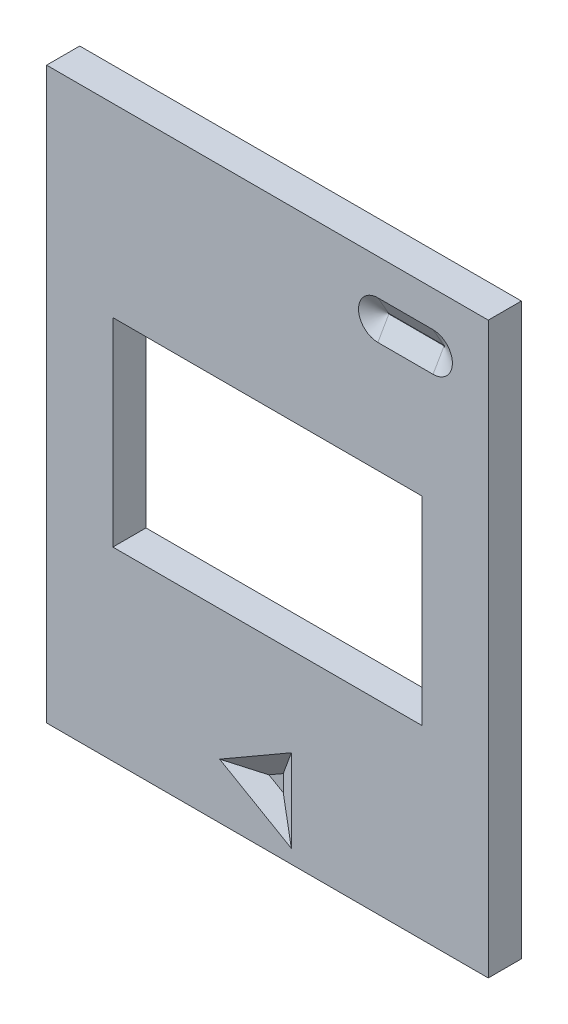
ISO-10303-21;
HEADER;
FILE_DESCRIPTION(('STEP AP214'),'2;1');
FILE_NAME('part.step','',(''),(''),'','','');
FILE_SCHEMA(('AUTOMOTIVE_DESIGN { 1 0 10303 214 1 1 1 1 }'));
ENDSEC;
DATA;
#1=APPLICATION_CONTEXT('core data for automotive mechanical design processes');
#2=APPLICATION_PROTOCOL_DEFINITION('international standard','automotive_design',2000,#1);
#3=PRODUCT_CONTEXT('',#1,'mechanical');
#4=PRODUCT('Part','Part','',(#3));
#5=PRODUCT_RELATED_PRODUCT_CATEGORY('part','',(#4));
#6=PRODUCT_DEFINITION_FORMATION('','',#4);
#7=PRODUCT_DEFINITION_CONTEXT('part definition',#1,'design');
#8=PRODUCT_DEFINITION('design','',#6,#7);
#9=PRODUCT_DEFINITION_SHAPE('','',#8);
#10=(LENGTH_UNIT() NAMED_UNIT(*) SI_UNIT(.MILLI.,.METRE.));
#11=(NAMED_UNIT(*) PLANE_ANGLE_UNIT() SI_UNIT($,.RADIAN.));
#12=(NAMED_UNIT(*) SI_UNIT($,.STERADIAN.) SOLID_ANGLE_UNIT());
#13=UNCERTAINTY_MEASURE_WITH_UNIT(LENGTH_MEASURE(1.E-05),#10,'distance_accuracy_value','');
#14=(GEOMETRIC_REPRESENTATION_CONTEXT(3) GLOBAL_UNCERTAINTY_ASSIGNED_CONTEXT((#13)) GLOBAL_UNIT_ASSIGNED_CONTEXT((#10,
#11,#12)) REPRESENTATION_CONTEXT('',''));
#15=CARTESIAN_POINT('',(0.,0.,0.));
#16=DIRECTION('',(0.,0.,1.));
#17=DIRECTION('',(1.,0.,0.));
#18=AXIS2_PLACEMENT_3D('',#15,#16,#17);
#19=CARTESIAN_POINT('',(40.,0.,-3.));
#20=DIRECTION('',(1.,0.,0.));
#21=DIRECTION('',(0.,0.,-1.));
#22=AXIS2_PLACEMENT_3D('',#19,#20,#21);
#23=PLANE('',#22);
#24=DIRECTION('',(0.,1.,0.));
#25=VECTOR('',#24,1.);
#26=CARTESIAN_POINT('',(40.,0.,0.));
#27=LINE('',#26,#25);
#28=CARTESIAN_POINT('',(40.,0.,0.));
#29=VERTEX_POINT('',#28);
#30=CARTESIAN_POINT('',(40.,51.6,0.));
#31=VERTEX_POINT('',#30);
#32=EDGE_CURVE('E227',#29,#31,#27,.T.);
#33=ORIENTED_EDGE('',*,*,#32,.F.);
#34=DIRECTION('',(0.,0.,1.));
#35=VECTOR('',#34,1.);
#36=CARTESIAN_POINT('',(40.,0.,-3.));
#37=LINE('',#36,#35);
#38=CARTESIAN_POINT('',(40.,0.,-3.));
#39=VERTEX_POINT('',#38);
#40=EDGE_CURVE('E11',#39,#29,#37,.T.);
#41=ORIENTED_EDGE('',*,*,#40,.F.);
#42=DIRECTION('',(0.,1.,0.));
#43=VECTOR('',#42,1.);
#44=CARTESIAN_POINT('',(40.,0.,-3.));
#45=LINE('',#44,#43);
#46=CARTESIAN_POINT('',(40.,51.6,-3.));
#47=VERTEX_POINT('',#46);
#48=EDGE_CURVE('E234',#39,#47,#45,.T.);
#49=ORIENTED_EDGE('',*,*,#48,.T.);
#50=DIRECTION('',(0.,0.,1.));
#51=VECTOR('',#50,1.);
#52=CARTESIAN_POINT('',(40.,51.6,-3.));
#53=LINE('',#52,#51);
#54=EDGE_CURVE('E36',#47,#31,#53,.T.);
#55=ORIENTED_EDGE('',*,*,#54,.T.);
#56=EDGE_LOOP('',(#33,#41,#49,#55));
#57=FACE_BOUND('',#56,.T.);
#58=ADVANCED_FACE('F33',(#57),#23,.T.);
#59=CARTESIAN_POINT('',(0.,0.,-3.));
#60=DIRECTION('',(0.,-1.,0.));
#61=DIRECTION('',(1.,0.,0.));
#62=AXIS2_PLACEMENT_3D('',#59,#60,#61);
#63=PLANE('',#62);
#64=DIRECTION('',(1.,0.,0.));
#65=VECTOR('',#64,1.);
#66=CARTESIAN_POINT('',(0.,0.,0.));
#67=LINE('',#66,#65);
#68=CARTESIAN_POINT('',(0.,0.,0.));
#69=VERTEX_POINT('',#68);
#70=EDGE_CURVE('E238',#69,#29,#67,.T.);
#71=ORIENTED_EDGE('',*,*,#70,.F.);
#72=DIRECTION('',(0.,0.,1.));
#73=VECTOR('',#72,1.);
#74=CARTESIAN_POINT('',(0.,0.,-3.));
#75=LINE('',#74,#73);
#76=CARTESIAN_POINT('',(0.,0.,-3.));
#77=VERTEX_POINT('',#76);
#78=EDGE_CURVE('E41',#77,#69,#75,.T.);
#79=ORIENTED_EDGE('',*,*,#78,.F.);
#80=DIRECTION('',(1.,0.,0.));
#81=VECTOR('',#80,1.);
#82=CARTESIAN_POINT('',(0.,0.,-3.));
#83=LINE('',#82,#81);
#84=EDGE_CURVE('E244',#77,#39,#83,.T.);
#85=ORIENTED_EDGE('',*,*,#84,.T.);
#86=ORIENTED_EDGE('',*,*,#40,.T.);
#87=EDGE_LOOP('',(#71,#79,#85,#86));
#88=FACE_BOUND('',#87,.T.);
#89=ADVANCED_FACE('F269',(#88),#63,.T.);
#90=CARTESIAN_POINT('',(0.,51.6,-3.));
#91=DIRECTION('',(-1.,0.,0.));
#92=DIRECTION('',(0.,0.,1.));
#93=AXIS2_PLACEMENT_3D('',#90,#91,#92);
#94=PLANE('',#93);
#95=DIRECTION('',(0.,-1.,0.));
#96=VECTOR('',#95,1.);
#97=CARTESIAN_POINT('',(0.,51.6,0.));
#98=LINE('',#97,#96);
#99=CARTESIAN_POINT('',(0.,51.6,0.));
#100=VERTEX_POINT('',#99);
#101=EDGE_CURVE('E252',#100,#69,#98,.T.);
#102=ORIENTED_EDGE('',*,*,#101,.F.);
#103=DIRECTION('',(0.,0.,1.));
#104=VECTOR('',#103,1.);
#105=CARTESIAN_POINT('',(0.,51.6,-3.));
#106=LINE('',#105,#104);
#107=CARTESIAN_POINT('',(0.,51.6,-3.));
#108=VERTEX_POINT('',#107);
#109=EDGE_CURVE('E257',#108,#100,#106,.T.);
#110=ORIENTED_EDGE('',*,*,#109,.F.);
#111=DIRECTION('',(0.,-1.,0.));
#112=VECTOR('',#111,1.);
#113=CARTESIAN_POINT('',(0.,51.6,-3.));
#114=LINE('',#113,#112);
#115=EDGE_CURVE('E241',#108,#77,#114,.T.);
#116=ORIENTED_EDGE('',*,*,#115,.T.);
#117=ORIENTED_EDGE('',*,*,#78,.T.);
#118=EDGE_LOOP('',(#102,#110,#116,#117));
#119=FACE_BOUND('',#118,.T.);
#120=ADVANCED_FACE('F275',(#119),#94,.T.);
#121=CARTESIAN_POINT('',(40.,51.6,-3.));
#122=DIRECTION('',(0.,1.,0.));
#123=DIRECTION('',(0.,0.,1.));
#124=AXIS2_PLACEMENT_3D('',#121,#122,#123);
#125=PLANE('',#124);
#126=DIRECTION('',(-1.,0.,0.));
#127=VECTOR('',#126,1.);
#128=CARTESIAN_POINT('',(40.,51.6,0.));
#129=LINE('',#128,#127);
#130=EDGE_CURVE('E249',#31,#100,#129,.T.);
#131=ORIENTED_EDGE('',*,*,#130,.F.);
#132=ORIENTED_EDGE('',*,*,#54,.F.);
#133=DIRECTION('',(-1.,0.,0.));
#134=VECTOR('',#133,1.);
#135=CARTESIAN_POINT('',(40.,51.6,-3.));
#136=LINE('',#135,#134);
#137=EDGE_CURVE('E237',#47,#108,#136,.T.);
#138=ORIENTED_EDGE('',*,*,#137,.T.);
#139=ORIENTED_EDGE('',*,*,#109,.T.);
#140=EDGE_LOOP('',(#131,#132,#138,#139));
#141=FACE_BOUND('',#140,.T.);
#142=ADVANCED_FACE('F265',(#141),#125,.T.);
#143=CARTESIAN_POINT('',(0.,0.,-3.));
#144=DIRECTION('',(0.,0.,1.));
#145=DIRECTION('',(1.,0.,0.));
#146=AXIS2_PLACEMENT_3D('',#143,#144,#145);
#147=PLANE('',#146);
#148=DIRECTION('',(0.,1.,0.));
#149=VECTOR('',#148,1.);
#150=CARTESIAN_POINT('',(6.,16.8,-3.));
#151=LINE('',#150,#149);
#152=CARTESIAN_POINT('',(6.,16.8,-3.));
#153=VERTEX_POINT('',#152);
#154=CARTESIAN_POINT('',(6.,34.8,-3.));
#155=VERTEX_POINT('',#154);
#156=EDGE_CURVE('E217',#153,#155,#151,.T.);
#157=ORIENTED_EDGE('',*,*,#156,.F.);
#158=DIRECTION('',(-1.,0.,0.));
#159=VECTOR('',#158,1.);
#160=CARTESIAN_POINT('',(34.,16.8,-3.));
#161=LINE('',#160,#159);
#162=CARTESIAN_POINT('',(34.,16.8,-3.));
#163=VERTEX_POINT('',#162);
#164=EDGE_CURVE('E184',#163,#153,#161,.T.);
#165=ORIENTED_EDGE('',*,*,#164,.F.);
#166=DIRECTION('',(0.,-1.,0.));
#167=VECTOR('',#166,1.);
#168=CARTESIAN_POINT('',(34.,34.8,-3.));
#169=LINE('',#168,#167);
#170=CARTESIAN_POINT('',(34.,34.8,-3.));
#171=VERTEX_POINT('',#170);
#172=EDGE_CURVE('E206',#171,#163,#169,.T.);
#173=ORIENTED_EDGE('',*,*,#172,.F.);
#174=DIRECTION('',(1.,0.,0.));
#175=VECTOR('',#174,1.);
#176=CARTESIAN_POINT('',(6.,34.8,-3.));
#177=LINE('',#176,#175);
#178=EDGE_CURVE('E220',#155,#171,#177,.T.);
#179=ORIENTED_EDGE('',*,*,#178,.F.);
#180=EDGE_LOOP('',(#157,#165,#173,#179));
#181=FACE_BOUND('',#180,.T.);
#182=ORIENTED_EDGE('',*,*,#48,.F.);
#183=ORIENTED_EDGE('',*,*,#84,.F.);
#184=ORIENTED_EDGE('',*,*,#115,.F.);
#185=ORIENTED_EDGE('',*,*,#137,.F.);
#186=EDGE_LOOP('',(#182,#183,#184,#185));
#187=FACE_BOUND('',#186,.T.);
#188=ADVANCED_FACE('F272',(#181,#187),#147,.F.);
#189=CARTESIAN_POINT('',(0.,0.,0.));
#190=DIRECTION('',(0.,0.,1.));
#191=DIRECTION('',(1.,0.,0.));
#192=AXIS2_PLACEMENT_3D('',#189,#190,#191);
#193=PLANE('',#192);
#194=DIRECTION('',(-0.866025403784429,-0.500000000000017,0.));
#195=VECTOR('',#194,1.);
#196=CARTESIAN_POINT('',(22.165063509461,8.75,0.));
#197=LINE('',#196,#195);
#198=CARTESIAN_POINT('',(22.165063509461,8.75,0.));
#199=VERTEX_POINT('',#198);
#200=CARTESIAN_POINT('',(15.669872981078,5.,0.));
#201=VERTEX_POINT('',#200);
#202=EDGE_CURVE('E49',#199,#201,#197,.T.);
#203=ORIENTED_EDGE('',*,*,#202,.F.);
#204=DIRECTION('',(0.,1.,0.));
#205=VECTOR('',#204,1.);
#206=CARTESIAN_POINT('',(22.165063509461,1.25,0.));
#207=LINE('',#206,#205);
#208=CARTESIAN_POINT('',(22.165063509461,1.25,0.));
#209=VERTEX_POINT('',#208);
#210=EDGE_CURVE('E144',#209,#199,#207,.T.);
#211=ORIENTED_EDGE('',*,*,#210,.F.);
#212=DIRECTION('',(0.866025403784429,-0.500000000000017,0.));
#213=VECTOR('',#212,1.);
#214=CARTESIAN_POINT('',(15.669872981078,5.,0.));
#215=LINE('',#214,#213);
#216=EDGE_CURVE('E154',#201,#209,#215,.T.);
#217=ORIENTED_EDGE('',*,*,#216,.F.);
#218=EDGE_LOOP('',(#203,#211,#217));
#219=FACE_BOUND('',#218,.T.);
#220=CARTESIAN_POINT('',(35.,46.6000000000023,0.));
#221=DIRECTION('',(0.,0.,1.));
#222=DIRECTION('',(1.,0.,0.));
#223=AXIS2_PLACEMENT_3D('',#220,#221,#222);
#224=CIRCLE('',#223,1.75000000001082);
#225=CARTESIAN_POINT('',(35.,44.8499999999914,0.));
#226=VERTEX_POINT('',#225);
#227=CARTESIAN_POINT('',(35.,48.3500000000131,0.));
#228=VERTEX_POINT('',#227);
#229=EDGE_CURVE('E57',#226,#228,#224,.T.);
#230=ORIENTED_EDGE('',*,*,#229,.F.);
#231=DIRECTION('',(1.,0.,0.));
#232=VECTOR('',#231,1.);
#233=CARTESIAN_POINT('',(30.,44.8499999999915,0.));
#234=LINE('',#233,#232);
#235=CARTESIAN_POINT('',(30.,44.8499999999915,0.));
#236=VERTEX_POINT('',#235);
#237=EDGE_CURVE('E178',#236,#226,#234,.T.);
#238=ORIENTED_EDGE('',*,*,#237,.F.);
#239=CARTESIAN_POINT('',(30.,46.6000000000023,0.));
#240=DIRECTION('',(0.,0.,1.));
#241=DIRECTION('',(1.,0.,0.));
#242=AXIS2_PLACEMENT_3D('',#239,#240,#241);
#243=CIRCLE('',#242,1.75000000001081);
#244=CARTESIAN_POINT('',(30.,48.3500000000131,0.));
#245=VERTEX_POINT('',#244);
#246=EDGE_CURVE('E175',#245,#236,#243,.T.);
#247=ORIENTED_EDGE('',*,*,#246,.F.);
#248=DIRECTION('',(-1.,0.,0.));
#249=VECTOR('',#248,1.);
#250=CARTESIAN_POINT('',(35.,48.3500000000131,0.));
#251=LINE('',#250,#249);
#252=EDGE_CURVE('E172',#228,#245,#251,.T.);
#253=ORIENTED_EDGE('',*,*,#252,.F.);
#254=EDGE_LOOP('',(#230,#238,#247,#253));
#255=FACE_BOUND('',#254,.T.);
#256=DIRECTION('',(-1.,0.,0.));
#257=VECTOR('',#256,1.);
#258=CARTESIAN_POINT('',(34.,16.8,0.));
#259=LINE('',#258,#257);
#260=CARTESIAN_POINT('',(34.,16.8,0.));
#261=VERTEX_POINT('',#260);
#262=CARTESIAN_POINT('',(6.,16.8,0.));
#263=VERTEX_POINT('',#262);
#264=EDGE_CURVE('E202',#261,#263,#259,.T.);
#265=ORIENTED_EDGE('',*,*,#264,.T.);
#266=DIRECTION('',(0.,1.,0.));
#267=VECTOR('',#266,1.);
#268=CARTESIAN_POINT('',(6.,16.8,0.));
#269=LINE('',#268,#267);
#270=CARTESIAN_POINT('',(6.,34.8,0.));
#271=VERTEX_POINT('',#270);
#272=EDGE_CURVE('E205',#263,#271,#269,.T.);
#273=ORIENTED_EDGE('',*,*,#272,.T.);
#274=DIRECTION('',(1.,0.,0.));
#275=VECTOR('',#274,1.);
#276=CARTESIAN_POINT('',(6.,34.8,0.));
#277=LINE('',#276,#275);
#278=CARTESIAN_POINT('',(34.,34.8,0.));
#279=VERTEX_POINT('',#278);
#280=EDGE_CURVE('E209',#271,#279,#277,.T.);
#281=ORIENTED_EDGE('',*,*,#280,.T.);
#282=DIRECTION('',(0.,-1.,0.));
#283=VECTOR('',#282,1.);
#284=CARTESIAN_POINT('',(34.,34.8,0.));
#285=LINE('',#284,#283);
#286=EDGE_CURVE('E212',#279,#261,#285,.T.);
#287=ORIENTED_EDGE('',*,*,#286,.T.);
#288=EDGE_LOOP('',(#265,#273,#281,#287));
#289=FACE_BOUND('',#288,.T.);
#290=ORIENTED_EDGE('',*,*,#32,.T.);
#291=ORIENTED_EDGE('',*,*,#130,.T.);
#292=ORIENTED_EDGE('',*,*,#101,.T.);
#293=ORIENTED_EDGE('',*,*,#70,.T.);
#294=EDGE_LOOP('',(#290,#291,#292,#293));
#295=FACE_BOUND('',#294,.T.);
#296=ADVANCED_FACE('F158',(#219,#255,#289,#295),#193,.T.);
#297=CARTESIAN_POINT('',(34.,16.8,0.));
#298=DIRECTION('',(0.,-1.,0.));
#299=DIRECTION('',(0.,0.,-1.));
#300=AXIS2_PLACEMENT_3D('',#297,#298,#299);
#301=PLANE('',#300);
#302=ORIENTED_EDGE('',*,*,#164,.T.);
#303=DIRECTION('',(0.,0.,-1.));
#304=VECTOR('',#303,1.);
#305=CARTESIAN_POINT('',(6.,16.8,0.));
#306=LINE('',#305,#304);
#307=EDGE_CURVE('E215',#263,#153,#306,.T.);
#308=ORIENTED_EDGE('',*,*,#307,.F.);
#309=ORIENTED_EDGE('',*,*,#264,.F.);
#310=DIRECTION('',(0.,0.,-1.));
#311=VECTOR('',#310,1.);
#312=CARTESIAN_POINT('',(34.,16.8,0.));
#313=LINE('',#312,#311);
#314=EDGE_CURVE('E225',#261,#163,#313,.T.);
#315=ORIENTED_EDGE('',*,*,#314,.T.);
#316=EDGE_LOOP('',(#302,#308,#309,#315));
#317=FACE_BOUND('',#316,.T.);
#318=ADVANCED_FACE('F316',(#317),#301,.F.);
#319=CARTESIAN_POINT('',(34.,34.8,0.));
#320=DIRECTION('',(1.,0.,0.));
#321=DIRECTION('',(0.,0.,-1.));
#322=AXIS2_PLACEMENT_3D('',#319,#320,#321);
#323=PLANE('',#322);
#324=ORIENTED_EDGE('',*,*,#172,.T.);
#325=ORIENTED_EDGE('',*,*,#314,.F.);
#326=ORIENTED_EDGE('',*,*,#286,.F.);
#327=DIRECTION('',(0.,0.,-1.));
#328=VECTOR('',#327,1.);
#329=CARTESIAN_POINT('',(34.,34.8,0.));
#330=LINE('',#329,#328);
#331=EDGE_CURVE('E228',#279,#171,#330,.T.);
#332=ORIENTED_EDGE('',*,*,#331,.T.);
#333=EDGE_LOOP('',(#324,#325,#326,#332));
#334=FACE_BOUND('',#333,.T.);
#335=ADVANCED_FACE('F321',(#334),#323,.F.);
#336=CARTESIAN_POINT('',(6.,34.8,0.));
#337=DIRECTION('',(0.,1.,0.));
#338=DIRECTION('',(0.,0.,1.));
#339=AXIS2_PLACEMENT_3D('',#336,#337,#338);
#340=PLANE('',#339);
#341=ORIENTED_EDGE('',*,*,#178,.T.);
#342=ORIENTED_EDGE('',*,*,#331,.F.);
#343=ORIENTED_EDGE('',*,*,#280,.F.);
#344=DIRECTION('',(0.,0.,-1.));
#345=VECTOR('',#344,1.);
#346=CARTESIAN_POINT('',(6.,34.8,0.));
#347=LINE('',#346,#345);
#348=EDGE_CURVE('E230',#271,#155,#347,.T.);
#349=ORIENTED_EDGE('',*,*,#348,.T.);
#350=EDGE_LOOP('',(#341,#342,#343,#349));
#351=FACE_BOUND('',#350,.T.);
#352=ADVANCED_FACE('F331',(#351),#340,.F.);
#353=CARTESIAN_POINT('',(6.,16.8,0.));
#354=DIRECTION('',(-1.,0.,0.));
#355=DIRECTION('',(0.,-1.,0.));
#356=AXIS2_PLACEMENT_3D('',#353,#354,#355);
#357=PLANE('',#356);
#358=ORIENTED_EDGE('',*,*,#156,.T.);
#359=ORIENTED_EDGE('',*,*,#348,.F.);
#360=ORIENTED_EDGE('',*,*,#272,.F.);
#361=ORIENTED_EDGE('',*,*,#307,.T.);
#362=EDGE_LOOP('',(#358,#359,#360,#361));
#363=FACE_BOUND('',#362,.T.);
#364=ADVANCED_FACE('F341',(#363),#357,.F.);
#365=CARTESIAN_POINT('',(35.,46.6000000000023,0.));
#366=DIRECTION('',(0.,0.,1.));
#367=DIRECTION('',(1.,0.,0.));
#368=AXIS2_PLACEMENT_3D('',#365,#366,#367);
#369=CONICAL_SURFACE('',#368,1.75000000001082,1.04719755119637);
#370=ORIENTED_EDGE('',*,*,#229,.T.);
#371=DIRECTION('',(0.,0.866025403784327,0.500000000000193));
#372=VECTOR('',#371,1.);
#373=CARTESIAN_POINT('',(35.,48.3500000000131,0.));
#374=LINE('',#373,#372);
#375=CARTESIAN_POINT('',(35.,46.6179491924451,-1.));
#376=VERTEX_POINT('',#375);
#377=EDGE_CURVE('E186',#376,#228,#374,.T.);
#378=ORIENTED_EDGE('',*,*,#377,.F.);
#379=CARTESIAN_POINT('',(35.,46.6000000000023,-1.));
#380=DIRECTION('',(0.,0.,1.));
#381=DIRECTION('',(1.,0.,0.));
#382=AXIS2_PLACEMENT_3D('',#379,#380,#381);
#383=CIRCLE('',#382,0.0179491924428331);
#384=CARTESIAN_POINT('',(35.,46.5820508075594,-1.));
#385=VERTEX_POINT('',#384);
#386=EDGE_CURVE('E181',#385,#376,#383,.T.);
#387=ORIENTED_EDGE('',*,*,#386,.F.);
#388=DIRECTION('',(0.,-0.866025403784327,0.500000000000193));
#389=VECTOR('',#388,1.);
#390=CARTESIAN_POINT('',(35.,44.8499999999914,0.));
#391=LINE('',#390,#389);
#392=EDGE_CURVE('E182',#385,#226,#391,.T.);
#393=ORIENTED_EDGE('',*,*,#392,.T.);
#394=EDGE_LOOP('',(#370,#378,#387,#393));
#395=FACE_BOUND('',#394,.T.);
#396=ADVANCED_FACE('F351',(#395),#369,.F.);
#397=CARTESIAN_POINT('',(30.,44.8499999999915,0.));
#398=DIRECTION('',(0.,-0.500000000000193,-0.866025403784327));
#399=DIRECTION('',(0.,0.866025403784327,-0.500000000000193));
#400=AXIS2_PLACEMENT_3D('',#397,#398,#399);
#401=PLANE('',#400);
#402=ORIENTED_EDGE('',*,*,#237,.T.);
#403=ORIENTED_EDGE('',*,*,#392,.F.);
#404=DIRECTION('',(1.,0.,0.));
#405=VECTOR('',#404,1.);
#406=CARTESIAN_POINT('',(35.,46.5820508075594,-1.));
#407=LINE('',#406,#405);
#408=CARTESIAN_POINT('',(30.,46.5820508075594,-1.));
#409=VERTEX_POINT('',#408);
#410=EDGE_CURVE('E189',#409,#385,#407,.T.);
#411=ORIENTED_EDGE('',*,*,#410,.F.);
#412=DIRECTION('',(0.,-0.866025403784327,0.500000000000193));
#413=VECTOR('',#412,1.);
#414=CARTESIAN_POINT('',(30.,44.8499999999915,0.));
#415=LINE('',#414,#413);
#416=EDGE_CURVE('E185',#409,#236,#415,.T.);
#417=ORIENTED_EDGE('',*,*,#416,.T.);
#418=EDGE_LOOP('',(#402,#403,#411,#417));
#419=FACE_BOUND('',#418,.T.);
#420=ADVANCED_FACE('F361',(#419),#401,.F.);
#421=CARTESIAN_POINT('',(30.,46.6000000000023,0.));
#422=DIRECTION('',(0.,0.,1.));
#423=DIRECTION('',(1.,0.,0.));
#424=AXIS2_PLACEMENT_3D('',#421,#422,#423);
#425=CONICAL_SURFACE('',#424,1.75000000001081,1.04719755119637);
#426=ORIENTED_EDGE('',*,*,#246,.T.);
#427=ORIENTED_EDGE('',*,*,#416,.F.);
#428=CARTESIAN_POINT('',(30.,46.6000000000023,-1.));
#429=DIRECTION('',(0.,0.,1.));
#430=DIRECTION('',(1.,0.,0.));
#431=AXIS2_PLACEMENT_3D('',#428,#429,#430);
#432=CIRCLE('',#431,0.0179491924428262);
#433=CARTESIAN_POINT('',(30.,46.6179491924451,-1.));
#434=VERTEX_POINT('',#433);
#435=EDGE_CURVE('E197',#434,#409,#432,.T.);
#436=ORIENTED_EDGE('',*,*,#435,.F.);
#437=DIRECTION('',(0.,0.866025403784327,0.500000000000193));
#438=VECTOR('',#437,1.);
#439=CARTESIAN_POINT('',(30.,48.3500000000131,0.));
#440=LINE('',#439,#438);
#441=EDGE_CURVE('E188',#434,#245,#440,.T.);
#442=ORIENTED_EDGE('',*,*,#441,.T.);
#443=EDGE_LOOP('',(#426,#427,#436,#442));
#444=FACE_BOUND('',#443,.T.);
#445=ADVANCED_FACE('F370',(#444),#425,.F.);
#446=CARTESIAN_POINT('',(35.,48.3500000000131,0.));
#447=DIRECTION('',(0.,0.500000000000193,-0.866025403784327));
#448=DIRECTION('',(0.,0.866025403784327,0.500000000000193));
#449=AXIS2_PLACEMENT_3D('',#446,#447,#448);
#450=PLANE('',#449);
#451=ORIENTED_EDGE('',*,*,#252,.T.);
#452=ORIENTED_EDGE('',*,*,#441,.F.);
#453=DIRECTION('',(-1.,0.,0.));
#454=VECTOR('',#453,1.);
#455=CARTESIAN_POINT('',(35.,46.6179491924451,-1.));
#456=LINE('',#455,#454);
#457=EDGE_CURVE('E194',#376,#434,#456,.T.);
#458=ORIENTED_EDGE('',*,*,#457,.F.);
#459=ORIENTED_EDGE('',*,*,#377,.T.);
#460=EDGE_LOOP('',(#451,#452,#458,#459));
#461=FACE_BOUND('',#460,.T.);
#462=ADVANCED_FACE('F380',(#461),#450,.F.);
#463=CARTESIAN_POINT('',(35.,46.6000000000023,-1.));
#464=DIRECTION('',(0.,0.,1.));
#465=DIRECTION('',(1.,0.,0.));
#466=AXIS2_PLACEMENT_3D('',#463,#464,#465);
#467=PLANE('',#466);
#468=ORIENTED_EDGE('',*,*,#386,.T.);
#469=ORIENTED_EDGE('',*,*,#457,.T.);
#470=ORIENTED_EDGE('',*,*,#435,.T.);
#471=ORIENTED_EDGE('',*,*,#410,.T.);
#472=EDGE_LOOP('',(#468,#469,#470,#471));
#473=FACE_BOUND('',#472,.T.);
#474=ADVANCED_FACE('F390',(#473),#467,.T.);
#475=CARTESIAN_POINT('',(22.165063509461,8.75,0.));
#476=DIRECTION('',(-0.24999999999999,0.433012701892184,-0.866025403784459));
#477=DIRECTION('',(0.,0.894427190999935,0.44721359549992));
#478=AXIS2_PLACEMENT_3D('',#475,#476,#477);
#479=PLANE('',#478);
#480=ORIENTED_EDGE('',*,*,#202,.T.);
#481=DIRECTION('',(-0.960768922830527,0.,0.277350098112599));
#482=VECTOR('',#481,1.);
#483=CARTESIAN_POINT('',(21.6654334688162,5.,-1.73076923076906));
#484=LINE('',#483,#482);
#485=CARTESIAN_POINT('',(19.133974596216,5.,-1.));
#486=VERTEX_POINT('',#485);
#487=EDGE_CURVE('E151',#486,#201,#484,.T.);
#488=ORIENTED_EDGE('',*,*,#487,.F.);
#489=DIRECTION('',(-0.866025403784429,-0.500000000000017,0.));
#490=VECTOR('',#489,1.);
#491=CARTESIAN_POINT('',(2.61843013959317,-4.53525403784483,-1.));
#492=LINE('',#491,#490);
#493=CARTESIAN_POINT('',(20.433012701892,5.74999999999965,-1.));
#494=VERTEX_POINT('',#493);
#495=EDGE_CURVE('E160',#494,#486,#492,.T.);
#496=ORIENTED_EDGE('',*,*,#495,.F.);
#497=DIRECTION('',(0.480384461415258,0.832050294337855,0.277350098112586));
#498=VECTOR('',#497,1.);
#499=CARTESIAN_POINT('',(19.1672832655918,3.55769230769216,-1.73076923076908));
#500=LINE('',#499,#498);
#501=EDGE_CURVE('E150',#494,#199,#500,.T.);
#502=ORIENTED_EDGE('',*,*,#501,.T.);
#503=EDGE_LOOP('',(#480,#488,#496,#502));
#504=FACE_BOUND('',#503,.T.);
#505=ADVANCED_FACE('F400',(#504),#479,.F.);
#506=CARTESIAN_POINT('',(22.165063509461,1.25,0.));
#507=DIRECTION('',(0.499999999999964,0.,-0.866025403784459));
#508=DIRECTION('',(-0.866025403784459,0.,-0.499999999999964));
#509=AXIS2_PLACEMENT_3D('',#506,#507,#508);
#510=PLANE('',#509);
#511=ORIENTED_EDGE('',*,*,#210,.T.);
#512=ORIENTED_EDGE('',*,*,#501,.F.);
#513=DIRECTION('',(0.,1.,0.));
#514=VECTOR('',#513,1.);
#515=CARTESIAN_POINT('',(20.433012701892,0.,-1.));
#516=LINE('',#515,#514);
#517=CARTESIAN_POINT('',(20.433012701892,4.25000000000035,-1.));
#518=VERTEX_POINT('',#517);
#519=EDGE_CURVE('E146',#518,#494,#516,.T.);
#520=ORIENTED_EDGE('',*,*,#519,.F.);
#521=DIRECTION('',(0.480384461415258,-0.832050294337855,0.277350098112586));
#522=VECTOR('',#521,1.);
#523=CARTESIAN_POINT('',(19.1672832655919,6.44230769230767,-1.73076923076902));
#524=LINE('',#523,#522);
#525=EDGE_CURVE('E140',#518,#209,#524,.T.);
#526=ORIENTED_EDGE('',*,*,#525,.T.);
#527=EDGE_LOOP('',(#511,#512,#520,#526));
#528=FACE_BOUND('',#527,.T.);
#529=ADVANCED_FACE('F142',(#528),#510,.F.);
#530=CARTESIAN_POINT('',(15.669872981078,5.,0.));
#531=DIRECTION('',(-0.24999999999999,-0.433012701892184,-0.866025403784459));
#532=DIRECTION('',(0.,0.894427190999935,-0.44721359549992));
#533=AXIS2_PLACEMENT_3D('',#530,#531,#532);
#534=PLANE('',#533);
#535=ORIENTED_EDGE('',*,*,#216,.T.);
#536=ORIENTED_EDGE('',*,*,#525,.F.);
#537=DIRECTION('',(0.866025403784429,-0.500000000000017,0.));
#538=VECTOR('',#537,1.);
#539=CARTESIAN_POINT('',(6.94855715851546,12.0352540378447,-1.));
#540=LINE('',#539,#538);
#541=EDGE_CURVE('E163',#486,#518,#540,.T.);
#542=ORIENTED_EDGE('',*,*,#541,.F.);
#543=ORIENTED_EDGE('',*,*,#487,.T.);
#544=EDGE_LOOP('',(#535,#536,#542,#543));
#545=FACE_BOUND('',#544,.T.);
#546=ADVANCED_FACE('F155',(#545),#534,.F.);
#547=CARTESIAN_POINT('',(0.,0.,-1.));
#548=DIRECTION('',(0.,0.,1.));
#549=DIRECTION('',(1.,0.,0.));
#550=AXIS2_PLACEMENT_3D('',#547,#548,#549);
#551=PLANE('',#550);
#552=ORIENTED_EDGE('',*,*,#495,.T.);
#553=ORIENTED_EDGE('',*,*,#541,.T.);
#554=ORIENTED_EDGE('',*,*,#519,.T.);
#555=EDGE_LOOP('',(#552,#553,#554));
#556=FACE_BOUND('',#555,.T.);
#557=ADVANCED_FACE('F432',(#556),#551,.T.);
#558=CLOSED_SHELL('',(#58,#89,#120,#142,#188,#296,#318,#335,#352,#364,#396,#420,#445,#462,#474,
#505,#529,#546,#557));
#559=MANIFOLD_SOLID_BREP('B2',#558);
#560=ADVANCED_BREP_SHAPE_REPRESENTATION('',(#18,#559),#14);
#561=SHAPE_DEFINITION_REPRESENTATION(#9,#560);
ENDSEC;
END-ISO-10303-21;
